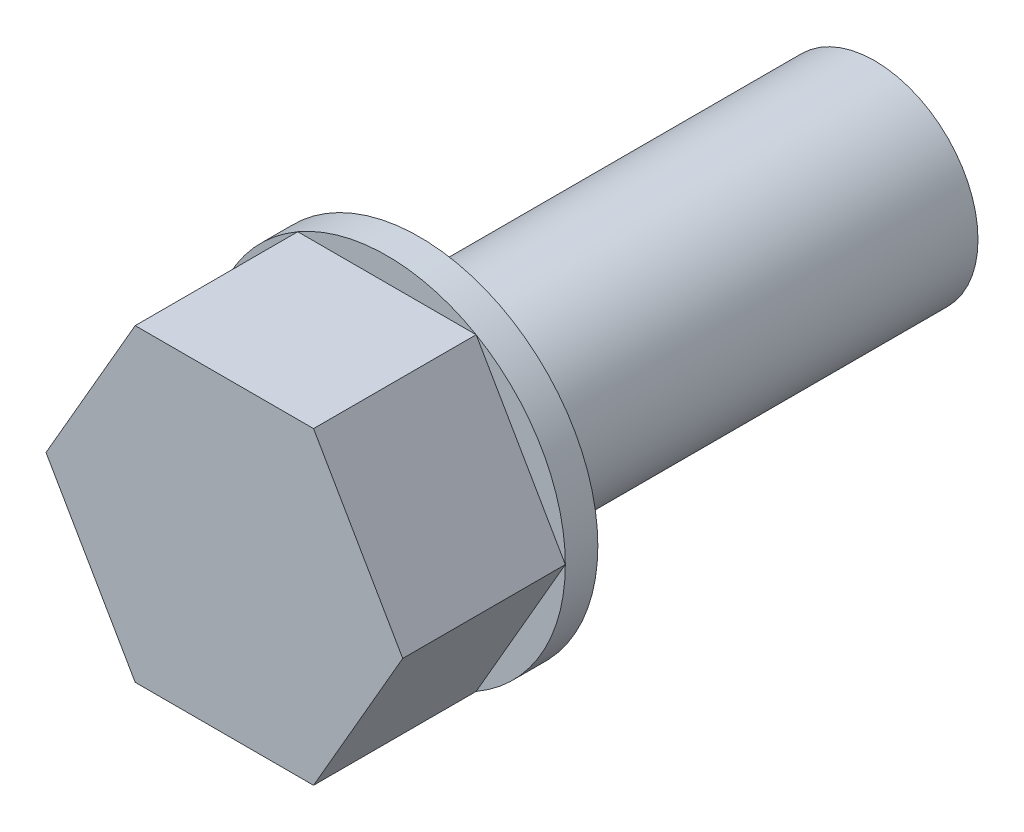
ISO-10303-21;
HEADER;
FILE_DESCRIPTION(('STEP AP214'),'2;1');
FILE_NAME('part.step','',(''),(''),'','','');
FILE_SCHEMA(('AUTOMOTIVE_DESIGN { 1 0 10303 214 1 1 1 1 }'));
ENDSEC;
DATA;
#1=APPLICATION_CONTEXT('core data for automotive mechanical design processes');
#2=APPLICATION_PROTOCOL_DEFINITION('international standard','automotive_design',2000,#1);
#3=PRODUCT_CONTEXT('',#1,'mechanical');
#4=PRODUCT('Part','Part','',(#3));
#5=PRODUCT_RELATED_PRODUCT_CATEGORY('part','',(#4));
#6=PRODUCT_DEFINITION_FORMATION('','',#4);
#7=PRODUCT_DEFINITION_CONTEXT('part definition',#1,'design');
#8=PRODUCT_DEFINITION('design','',#6,#7);
#9=PRODUCT_DEFINITION_SHAPE('','',#8);
#10=(LENGTH_UNIT() NAMED_UNIT(*) SI_UNIT(.MILLI.,.METRE.));
#11=(NAMED_UNIT(*) PLANE_ANGLE_UNIT() SI_UNIT($,.RADIAN.));
#12=(NAMED_UNIT(*) SI_UNIT($,.STERADIAN.) SOLID_ANGLE_UNIT());
#13=UNCERTAINTY_MEASURE_WITH_UNIT(LENGTH_MEASURE(1.E-05),#10,'distance_accuracy_value','');
#14=(GEOMETRIC_REPRESENTATION_CONTEXT(3) GLOBAL_UNCERTAINTY_ASSIGNED_CONTEXT((#13)) GLOBAL_UNIT_ASSIGNED_CONTEXT((#10,
#11,#12)) REPRESENTATION_CONTEXT('',''));
#15=CARTESIAN_POINT('',(0.,0.,0.));
#16=DIRECTION('',(0.,0.,1.));
#17=DIRECTION('',(1.,0.,0.));
#18=AXIS2_PLACEMENT_3D('',#15,#16,#17);
#19=CARTESIAN_POINT('',(0.,0.,30.));
#20=DIRECTION('',(0.,0.,-1.));
#21=DIRECTION('',(-1.,0.,0.));
#22=AXIS2_PLACEMENT_3D('',#19,#20,#21);
#23=CYLINDRICAL_SURFACE('',#22,6.35);
#24=CARTESIAN_POINT('',(0.,0.,28.));
#25=DIRECTION('',(0.,0.,-1.));
#26=DIRECTION('',(-1.,0.,0.));
#27=AXIS2_PLACEMENT_3D('',#24,#25,#26);
#28=CIRCLE('',#27,6.35);
#29=CARTESIAN_POINT('',(-6.35,0.,28.));
#30=VERTEX_POINT('',#29);
#31=EDGE_CURVE('E35',#30,#30,#28,.T.);
#32=ORIENTED_EDGE('',*,*,#31,.T.);
#33=EDGE_LOOP('',(#32));
#34=FACE_BOUND('',#33,.T.);
#35=CARTESIAN_POINT('',(0.,0.,0.));
#36=DIRECTION('',(0.,0.,1.));
#37=DIRECTION('',(1.,0.,0.));
#38=AXIS2_PLACEMENT_3D('',#35,#36,#37);
#39=CIRCLE('',#38,6.35);
#40=CARTESIAN_POINT('',(6.35,0.,0.));
#41=VERTEX_POINT('',#40);
#42=EDGE_CURVE('E11',#41,#41,#39,.T.);
#43=ORIENTED_EDGE('',*,*,#42,.T.);
#44=EDGE_LOOP('',(#43));
#45=FACE_BOUND('',#44,.T.);
#46=ADVANCED_FACE('F32',(#34,#45),#23,.T.);
#47=CARTESIAN_POINT('',(0.,0.,0.));
#48=DIRECTION('',(0.,0.,1.));
#49=DIRECTION('',(1.,0.,0.));
#50=AXIS2_PLACEMENT_3D('',#47,#48,#49);
#51=PLANE('',#50);
#52=ORIENTED_EDGE('',*,*,#42,.F.);
#53=EDGE_LOOP('',(#52));
#54=FACE_BOUND('',#53,.T.);
#55=ADVANCED_FACE('F186',(#54),#51,.F.);
#56=CARTESIAN_POINT('',(0.,0.,30.));
#57=DIRECTION('',(0.,0.,-1.));
#58=DIRECTION('',(-1.,0.,0.));
#59=AXIS2_PLACEMENT_3D('',#56,#57,#58);
#60=PLANE('',#59);
#61=CARTESIAN_POINT('',(0.,0.,30.));
#62=DIRECTION('',(0.,0.,-1.));
#63=DIRECTION('',(-1.,0.,0.));
#64=AXIS2_PLACEMENT_3D('',#61,#62,#63);
#65=CIRCLE('',#64,10.9696551146029);
#66=CARTESIAN_POINT('',(10.9696551146029,0.,30.));
#67=VERTEX_POINT('',#66);
#68=CARTESIAN_POINT('',(5.48482755730145,-9.5,30.));
#69=VERTEX_POINT('',#68);
#70=EDGE_CURVE('E225',#67,#69,#65,.T.);
#71=ORIENTED_EDGE('',*,*,#70,.F.);
#72=DIRECTION('',(0.5,0.866025403784439,0.));
#73=VECTOR('',#72,1.);
#74=CARTESIAN_POINT('',(5.48482755730145,-9.5,30.));
#75=LINE('',#74,#73);
#76=EDGE_CURVE('E146',#69,#67,#75,.T.);
#77=ORIENTED_EDGE('',*,*,#76,.F.);
#78=EDGE_LOOP('',(#71,#77));
#79=FACE_BOUND('',#78,.T.);
#80=ADVANCED_FACE('F183',(#79),#60,.F.);
#81=CARTESIAN_POINT('',(5.48482755730144,9.5,30.));
#82=VERTEX_POINT('',#81);
#83=EDGE_CURVE('E224',#82,#67,#65,.T.);
#84=ORIENTED_EDGE('',*,*,#83,.F.);
#85=DIRECTION('',(-0.5,0.866025403784438,0.));
#86=VECTOR('',#85,1.);
#87=CARTESIAN_POINT('',(10.9696551146029,0.,30.));
#88=LINE('',#87,#86);
#89=EDGE_CURVE('E140',#67,#82,#88,.T.);
#90=ORIENTED_EDGE('',*,*,#89,.F.);
#91=EDGE_LOOP('',(#84,#90));
#92=FACE_BOUND('',#91,.T.);
#93=ADVANCED_FACE('F198',(#92),#60,.F.);
#94=CARTESIAN_POINT('',(-5.48482755730145,9.49999999999999,30.));
#95=VERTEX_POINT('',#94);
#96=EDGE_CURVE('E109',#95,#82,#65,.T.);
#97=ORIENTED_EDGE('',*,*,#96,.F.);
#98=DIRECTION('',(-1.,0.,0.));
#99=VECTOR('',#98,1.);
#100=CARTESIAN_POINT('',(5.48482755730144,9.5,30.));
#101=LINE('',#100,#99);
#102=EDGE_CURVE('E119',#82,#95,#101,.T.);
#103=ORIENTED_EDGE('',*,*,#102,.F.);
#104=EDGE_LOOP('',(#97,#103));
#105=FACE_BOUND('',#104,.T.);
#106=ADVANCED_FACE('F221',(#105),#60,.F.);
#107=CARTESIAN_POINT('',(-10.9696551146029,0.,30.));
#108=VERTEX_POINT('',#107);
#109=EDGE_CURVE('E98',#108,#95,#65,.T.);
#110=ORIENTED_EDGE('',*,*,#109,.F.);
#111=DIRECTION('',(-0.5,-0.866025403784439,0.));
#112=VECTOR('',#111,1.);
#113=CARTESIAN_POINT('',(-5.48482755730145,9.5,30.));
#114=LINE('',#113,#112);
#115=EDGE_CURVE('E91',#95,#108,#114,.T.);
#116=ORIENTED_EDGE('',*,*,#115,.F.);
#117=EDGE_LOOP('',(#110,#116));
#118=FACE_BOUND('',#117,.T.);
#119=ADVANCED_FACE('F106',(#118),#60,.F.);
#120=CARTESIAN_POINT('',(-5.48482755730145,-9.49999999999999,30.));
#121=VERTEX_POINT('',#120);
#122=EDGE_CURVE('E84',#121,#108,#65,.T.);
#123=ORIENTED_EDGE('',*,*,#122,.F.);
#124=DIRECTION('',(0.5,-0.866025403784439,0.));
#125=VECTOR('',#124,1.);
#126=CARTESIAN_POINT('',(-10.9696551146029,0.,30.));
#127=LINE('',#126,#125);
#128=EDGE_CURVE('E81',#108,#121,#127,.T.);
#129=ORIENTED_EDGE('',*,*,#128,.F.);
#130=EDGE_LOOP('',(#123,#129));
#131=FACE_BOUND('',#130,.T.);
#132=ADVANCED_FACE('F83',(#131),#60,.F.);
#133=EDGE_CURVE('E102',#69,#121,#65,.T.);
#134=ORIENTED_EDGE('',*,*,#133,.F.);
#135=DIRECTION('',(1.,0.,0.));
#136=VECTOR('',#135,1.);
#137=CARTESIAN_POINT('',(-5.48482755730145,-9.5,30.));
#138=LINE('',#137,#136);
#139=EDGE_CURVE('E90',#121,#69,#138,.T.);
#140=ORIENTED_EDGE('',*,*,#139,.F.);
#141=EDGE_LOOP('',(#134,#140));
#142=FACE_BOUND('',#141,.T.);
#143=ADVANCED_FACE('F172',(#142),#60,.F.);
#144=CARTESIAN_POINT('',(0.,0.,28.));
#145=DIRECTION('',(0.,0.,1.));
#146=DIRECTION('',(1.,0.,0.));
#147=AXIS2_PLACEMENT_3D('',#144,#145,#146);
#148=CYLINDRICAL_SURFACE('',#147,10.9696551146029);
#149=CARTESIAN_POINT('',(0.,0.,28.));
#150=DIRECTION('',(0.,0.,-1.));
#151=DIRECTION('',(-1.,0.,0.));
#152=AXIS2_PLACEMENT_3D('',#149,#150,#151);
#153=CIRCLE('',#152,10.9696551146029);
#154=CARTESIAN_POINT('',(-10.9696551146029,0.,28.));
#155=VERTEX_POINT('',#154);
#156=EDGE_CURVE('E108',#155,#155,#153,.T.);
#157=ORIENTED_EDGE('',*,*,#156,.F.);
#158=EDGE_LOOP('',(#157));
#159=FACE_BOUND('',#158,.T.);
#160=ORIENTED_EDGE('',*,*,#109,.T.);
#161=ORIENTED_EDGE('',*,*,#96,.T.);
#162=ORIENTED_EDGE('',*,*,#83,.T.);
#163=ORIENTED_EDGE('',*,*,#70,.T.);
#164=ORIENTED_EDGE('',*,*,#133,.T.);
#165=ORIENTED_EDGE('',*,*,#122,.T.);
#166=EDGE_LOOP('',(#160,#161,#162,#163,#164,#165));
#167=FACE_BOUND('',#166,.T.);
#168=ADVANCED_FACE('F96',(#159,#167),#148,.T.);
#169=CARTESIAN_POINT('',(0.,0.,28.));
#170=DIRECTION('',(0.,0.,-1.));
#171=DIRECTION('',(-1.,0.,0.));
#172=AXIS2_PLACEMENT_3D('',#169,#170,#171);
#173=PLANE('',#172);
#174=ORIENTED_EDGE('',*,*,#31,.F.);
#175=EDGE_LOOP('',(#174));
#176=FACE_BOUND('',#175,.T.);
#177=ORIENTED_EDGE('',*,*,#156,.T.);
#178=EDGE_LOOP('',(#177));
#179=FACE_BOUND('',#178,.T.);
#180=ADVANCED_FACE('F169',(#176,#179),#173,.T.);
#181=CARTESIAN_POINT('',(0.,0.,40.));
#182=DIRECTION('',(0.,0.,1.));
#183=DIRECTION('',(1.,0.,0.));
#184=AXIS2_PLACEMENT_3D('',#181,#182,#183);
#185=PLANE('',#184);
#186=DIRECTION('',(0.5,0.866025403784439,0.));
#187=VECTOR('',#186,1.);
#188=CARTESIAN_POINT('',(5.48482755730145,-9.5,40.));
#189=LINE('',#188,#187);
#190=CARTESIAN_POINT('',(5.48482755730145,-9.5,40.));
#191=VERTEX_POINT('',#190);
#192=CARTESIAN_POINT('',(10.9696551146029,0.,40.));
#193=VERTEX_POINT('',#192);
#194=EDGE_CURVE('E158',#191,#193,#189,.T.);
#195=ORIENTED_EDGE('',*,*,#194,.T.);
#196=DIRECTION('',(-0.5,0.866025403784438,0.));
#197=VECTOR('',#196,1.);
#198=CARTESIAN_POINT('',(10.9696551146029,0.,40.));
#199=LINE('',#198,#197);
#200=CARTESIAN_POINT('',(5.48482755730144,9.5,40.));
#201=VERTEX_POINT('',#200);
#202=EDGE_CURVE('E141',#193,#201,#199,.T.);
#203=ORIENTED_EDGE('',*,*,#202,.T.);
#204=DIRECTION('',(-1.,0.,0.));
#205=VECTOR('',#204,1.);
#206=CARTESIAN_POINT('',(5.48482755730144,9.5,40.));
#207=LINE('',#206,#205);
#208=CARTESIAN_POINT('',(-5.48482755730145,9.5,40.));
#209=VERTEX_POINT('',#208);
#210=EDGE_CURVE('E160',#201,#209,#207,.T.);
#211=ORIENTED_EDGE('',*,*,#210,.T.);
#212=DIRECTION('',(-0.5,-0.866025403784439,0.));
#213=VECTOR('',#212,1.);
#214=CARTESIAN_POINT('',(-5.48482755730145,9.5,40.));
#215=LINE('',#214,#213);
#216=CARTESIAN_POINT('',(-10.9696551146029,0.,40.));
#217=VERTEX_POINT('',#216);
#218=EDGE_CURVE('E159',#209,#217,#215,.T.);
#219=ORIENTED_EDGE('',*,*,#218,.T.);
#220=DIRECTION('',(0.5,-0.866025403784439,0.));
#221=VECTOR('',#220,1.);
#222=CARTESIAN_POINT('',(-10.9696551146029,0.,40.));
#223=LINE('',#222,#221);
#224=CARTESIAN_POINT('',(-5.48482755730145,-9.5,40.));
#225=VERTEX_POINT('',#224);
#226=EDGE_CURVE('E122',#217,#225,#223,.T.);
#227=ORIENTED_EDGE('',*,*,#226,.T.);
#228=DIRECTION('',(1.,0.,0.));
#229=VECTOR('',#228,1.);
#230=CARTESIAN_POINT('',(-5.48482755730145,-9.5,40.));
#231=LINE('',#230,#229);
#232=EDGE_CURVE('E48',#225,#191,#231,.T.);
#233=ORIENTED_EDGE('',*,*,#232,.T.);
#234=EDGE_LOOP('',(#195,#203,#211,#219,#227,#233));
#235=FACE_BOUND('',#234,.T.);
#236=ADVANCED_FACE('F178',(#235),#185,.T.);
#237=CARTESIAN_POINT('',(-5.48482755730145,-9.5,40.));
#238=DIRECTION('',(0.,1.,0.));
#239=DIRECTION('',(0.,0.,1.));
#240=AXIS2_PLACEMENT_3D('',#237,#238,#239);
#241=PLANE('',#240);
#242=ORIENTED_EDGE('',*,*,#139,.T.);
#243=DIRECTION('',(0.,0.,-1.));
#244=VECTOR('',#243,1.);
#245=CARTESIAN_POINT('',(5.48482755730145,-9.5,40.));
#246=LINE('',#245,#244);
#247=EDGE_CURVE('E127',#191,#69,#246,.T.);
#248=ORIENTED_EDGE('',*,*,#247,.F.);
#249=ORIENTED_EDGE('',*,*,#232,.F.);
#250=DIRECTION('',(0.,0.,-1.));
#251=VECTOR('',#250,1.);
#252=CARTESIAN_POINT('',(-5.48482755730145,-9.5,40.));
#253=LINE('',#252,#251);
#254=EDGE_CURVE('E123',#225,#121,#253,.T.);
#255=ORIENTED_EDGE('',*,*,#254,.T.);
#256=EDGE_LOOP('',(#242,#248,#249,#255));
#257=FACE_BOUND('',#256,.T.);
#258=ADVANCED_FACE('F212',(#257),#241,.F.);
#259=CARTESIAN_POINT('',(-10.9696551146029,0.,40.));
#260=DIRECTION('',(0.866025403784439,0.5,0.));
#261=DIRECTION('',(-0.5,0.866025403784439,0.));
#262=AXIS2_PLACEMENT_3D('',#259,#260,#261);
#263=PLANE('',#262);
#264=ORIENTED_EDGE('',*,*,#128,.T.);
#265=ORIENTED_EDGE('',*,*,#254,.F.);
#266=ORIENTED_EDGE('',*,*,#226,.F.);
#267=DIRECTION('',(0.,0.,-1.));
#268=VECTOR('',#267,1.);
#269=CARTESIAN_POINT('',(-10.9696551146029,0.,40.));
#270=LINE('',#269,#268);
#271=EDGE_CURVE('E115',#217,#108,#270,.T.);
#272=ORIENTED_EDGE('',*,*,#271,.T.);
#273=EDGE_LOOP('',(#264,#265,#266,#272));
#274=FACE_BOUND('',#273,.T.);
#275=ADVANCED_FACE('F121',(#274),#263,.F.);
#276=CARTESIAN_POINT('',(-5.48482755730145,9.5,40.));
#277=DIRECTION('',(0.866025403784439,-0.5,0.));
#278=DIRECTION('',(0.5,0.866025403784439,0.));
#279=AXIS2_PLACEMENT_3D('',#276,#277,#278);
#280=PLANE('',#279);
#281=ORIENTED_EDGE('',*,*,#115,.T.);
#282=ORIENTED_EDGE('',*,*,#271,.F.);
#283=ORIENTED_EDGE('',*,*,#218,.F.);
#284=DIRECTION('',(0.,0.,-1.));
#285=VECTOR('',#284,1.);
#286=CARTESIAN_POINT('',(-5.48482755730145,9.5,40.));
#287=LINE('',#286,#285);
#288=EDGE_CURVE('E118',#209,#95,#287,.T.);
#289=ORIENTED_EDGE('',*,*,#288,.T.);
#290=EDGE_LOOP('',(#281,#282,#283,#289));
#291=FACE_BOUND('',#290,.T.);
#292=ADVANCED_FACE('F113',(#291),#280,.F.);
#293=CARTESIAN_POINT('',(5.48482755730144,9.5,40.));
#294=DIRECTION('',(0.,-1.,0.));
#295=DIRECTION('',(1.,0.,0.));
#296=AXIS2_PLACEMENT_3D('',#293,#294,#295);
#297=PLANE('',#296);
#298=ORIENTED_EDGE('',*,*,#102,.T.);
#299=ORIENTED_EDGE('',*,*,#288,.F.);
#300=ORIENTED_EDGE('',*,*,#210,.F.);
#301=DIRECTION('',(0.,0.,-1.));
#302=VECTOR('',#301,1.);
#303=CARTESIAN_POINT('',(5.48482755730144,9.5,40.));
#304=LINE('',#303,#302);
#305=EDGE_CURVE('E125',#201,#82,#304,.T.);
#306=ORIENTED_EDGE('',*,*,#305,.T.);
#307=EDGE_LOOP('',(#298,#299,#300,#306));
#308=FACE_BOUND('',#307,.T.);
#309=ADVANCED_FACE('F204',(#308),#297,.F.);
#310=CARTESIAN_POINT('',(10.9696551146029,0.,40.));
#311=DIRECTION('',(-0.866025403784438,-0.5,0.));
#312=DIRECTION('',(0.5,-0.866025403784439,0.));
#313=AXIS2_PLACEMENT_3D('',#310,#311,#312);
#314=PLANE('',#313);
#315=ORIENTED_EDGE('',*,*,#89,.T.);
#316=ORIENTED_EDGE('',*,*,#305,.F.);
#317=ORIENTED_EDGE('',*,*,#202,.F.);
#318=DIRECTION('',(0.,0.,-1.));
#319=VECTOR('',#318,1.);
#320=CARTESIAN_POINT('',(10.9696551146029,0.,40.));
#321=LINE('',#320,#319);
#322=EDGE_CURVE('E41',#193,#67,#321,.T.);
#323=ORIENTED_EDGE('',*,*,#322,.T.);
#324=EDGE_LOOP('',(#315,#316,#317,#323));
#325=FACE_BOUND('',#324,.T.);
#326=ADVANCED_FACE('F138',(#325),#314,.F.);
#327=CARTESIAN_POINT('',(5.48482755730145,-9.5,40.));
#328=DIRECTION('',(-0.866025403784439,0.5,0.));
#329=DIRECTION('',(-0.5,-0.866025403784439,0.));
#330=AXIS2_PLACEMENT_3D('',#327,#328,#329);
#331=PLANE('',#330);
#332=ORIENTED_EDGE('',*,*,#76,.T.);
#333=ORIENTED_EDGE('',*,*,#322,.F.);
#334=ORIENTED_EDGE('',*,*,#194,.F.);
#335=ORIENTED_EDGE('',*,*,#247,.T.);
#336=EDGE_LOOP('',(#332,#333,#334,#335));
#337=FACE_BOUND('',#336,.T.);
#338=ADVANCED_FACE('F147',(#337),#331,.F.);
#339=CLOSED_SHELL('',(#46,#55,#80,#93,#106,#119,#132,#143,#168,#180,#236,#258,#275,#292,#309,
#326,#338));
#340=MANIFOLD_SOLID_BREP('B2',#339);
#341=ADVANCED_BREP_SHAPE_REPRESENTATION('',(#18,#340),#14);
#342=SHAPE_DEFINITION_REPRESENTATION(#9,#341);
ENDSEC;
END-ISO-10303-21;
